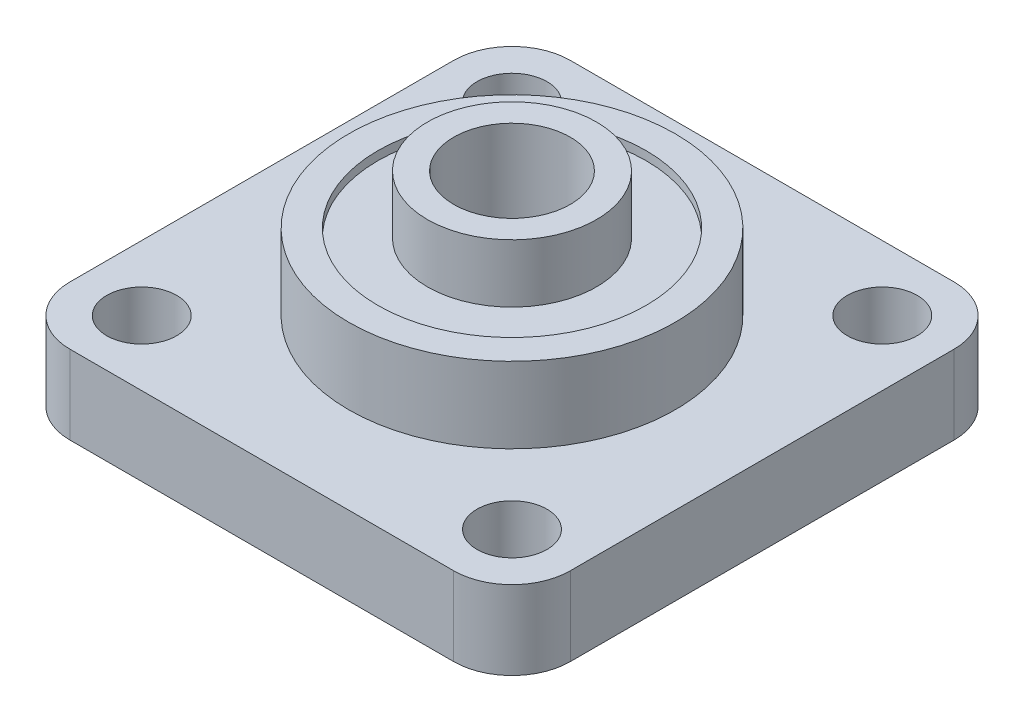
ISO-10303-21;
HEADER;
FILE_DESCRIPTION(('STEP AP214'),'2;1');
FILE_NAME('part.step','',(''),(''),'','','');
FILE_SCHEMA(('AUTOMOTIVE_DESIGN { 1 0 10303 214 1 1 1 1 }'));
ENDSEC;
DATA;
#1=APPLICATION_CONTEXT('core data for automotive mechanical design processes');
#2=APPLICATION_PROTOCOL_DEFINITION('international standard','automotive_design',2000,#1);
#3=PRODUCT_CONTEXT('',#1,'mechanical');
#4=PRODUCT('Part','Part','',(#3));
#5=PRODUCT_RELATED_PRODUCT_CATEGORY('part','',(#4));
#6=PRODUCT_DEFINITION_FORMATION('','',#4);
#7=PRODUCT_DEFINITION_CONTEXT('part definition',#1,'design');
#8=PRODUCT_DEFINITION('design','',#6,#7);
#9=PRODUCT_DEFINITION_SHAPE('','',#8);
#10=(LENGTH_UNIT() NAMED_UNIT(*) SI_UNIT(.MILLI.,.METRE.));
#11=(NAMED_UNIT(*) PLANE_ANGLE_UNIT() SI_UNIT($,.RADIAN.));
#12=(NAMED_UNIT(*) SI_UNIT($,.STERADIAN.) SOLID_ANGLE_UNIT());
#13=UNCERTAINTY_MEASURE_WITH_UNIT(LENGTH_MEASURE(1.E-05),#10,'distance_accuracy_value','');
#14=(GEOMETRIC_REPRESENTATION_CONTEXT(3) GLOBAL_UNCERTAINTY_ASSIGNED_CONTEXT((#13)) GLOBAL_UNIT_ASSIGNED_CONTEXT((#10,
#11,#12)) REPRESENTATION_CONTEXT('',''));
#15=CARTESIAN_POINT('',(0.,0.,0.));
#16=DIRECTION('',(0.,0.,1.));
#17=DIRECTION('',(1.,0.,0.));
#18=AXIS2_PLACEMENT_3D('',#15,#16,#17);
#19=CARTESIAN_POINT('',(0.,50.9424778761063,0.));
#20=DIRECTION('',(0.,1.,0.));
#21=DIRECTION('',(0.,0.,1.));
#22=AXIS2_PLACEMENT_3D('',#19,#20,#21);
#23=CYLINDRICAL_SURFACE('',#22,10.);
#24=CARTESIAN_POINT('',(0.,30.,0.));
#25=DIRECTION('',(0.,1.,0.));
#26=DIRECTION('',(0.,0.,1.));
#27=AXIS2_PLACEMENT_3D('',#24,#25,#26);
#28=CIRCLE('',#27,10.);
#29=CARTESIAN_POINT('',(0.,30.,10.));
#30=VERTEX_POINT('',#29);
#31=EDGE_CURVE('E161',#30,#30,#28,.T.);
#32=ORIENTED_EDGE('',*,*,#31,.T.);
#33=EDGE_LOOP('',(#32));
#34=FACE_BOUND('',#33,.T.);
#35=CARTESIAN_POINT('',(0.,-5.,0.));
#36=DIRECTION('',(0.,1.,0.));
#37=DIRECTION('',(0.,0.,1.));
#38=AXIS2_PLACEMENT_3D('',#35,#36,#37);
#39=CIRCLE('',#38,10.);
#40=CARTESIAN_POINT('',(0.,-5.,10.));
#41=VERTEX_POINT('',#40);
#42=EDGE_CURVE('E223',#41,#41,#39,.T.);
#43=ORIENTED_EDGE('',*,*,#42,.F.);
#44=EDGE_LOOP('',(#43));
#45=FACE_BOUND('',#44,.T.);
#46=ADVANCED_FACE('F37',(#34,#45),#23,.F.);
#47=CARTESIAN_POINT('',(10.,30.,0.));
#48=DIRECTION('',(0.,1.,0.));
#49=DIRECTION('',(0.,0.,1.));
#50=AXIS2_PLACEMENT_3D('',#47,#48,#49);
#51=PLANE('',#50);
#52=CARTESIAN_POINT('',(0.,30.,0.));
#53=DIRECTION('',(0.,1.,0.));
#54=DIRECTION('',(0.,0.,1.));
#55=AXIS2_PLACEMENT_3D('',#52,#53,#54);
#56=CIRCLE('',#55,14.5);
#57=CARTESIAN_POINT('',(0.,30.,14.5));
#58=VERTEX_POINT('',#57);
#59=EDGE_CURVE('E158',#58,#58,#56,.T.);
#60=ORIENTED_EDGE('',*,*,#59,.T.);
#61=EDGE_LOOP('',(#60));
#62=FACE_BOUND('',#61,.T.);
#63=ORIENTED_EDGE('',*,*,#31,.F.);
#64=EDGE_LOOP('',(#63));
#65=FACE_BOUND('',#64,.T.);
#66=ADVANCED_FACE('F231',(#62,#65),#51,.T.);
#67=CARTESIAN_POINT('',(0.,50.9424778761063,0.));
#68=DIRECTION('',(0.,1.,0.));
#69=DIRECTION('',(0.,0.,1.));
#70=AXIS2_PLACEMENT_3D('',#67,#68,#69);
#71=CYLINDRICAL_SURFACE('',#70,14.5);
#72=CARTESIAN_POINT('',(0.,20.,0.));
#73=DIRECTION('',(0.,1.,0.));
#74=DIRECTION('',(0.,0.,1.));
#75=AXIS2_PLACEMENT_3D('',#72,#73,#74);
#76=CIRCLE('',#75,14.5);
#77=CARTESIAN_POINT('',(0.,20.,14.5));
#78=VERTEX_POINT('',#77);
#79=EDGE_CURVE('E155',#78,#78,#76,.T.);
#80=ORIENTED_EDGE('',*,*,#79,.T.);
#81=EDGE_LOOP('',(#80));
#82=FACE_BOUND('',#81,.T.);
#83=ORIENTED_EDGE('',*,*,#59,.F.);
#84=EDGE_LOOP('',(#83));
#85=FACE_BOUND('',#84,.T.);
#86=ADVANCED_FACE('F237',(#82,#85),#71,.T.);
#87=CARTESIAN_POINT('',(14.5,20.,0.));
#88=DIRECTION('',(0.,1.,0.));
#89=DIRECTION('',(0.,0.,1.));
#90=AXIS2_PLACEMENT_3D('',#87,#88,#89);
#91=PLANE('',#90);
#92=CARTESIAN_POINT('',(0.,20.,0.));
#93=DIRECTION('',(0.,1.,0.));
#94=DIRECTION('',(0.,0.,1.));
#95=AXIS2_PLACEMENT_3D('',#92,#93,#94);
#96=CIRCLE('',#95,23.);
#97=CARTESIAN_POINT('',(0.,20.,23.));
#98=VERTEX_POINT('',#97);
#99=EDGE_CURVE('E152',#98,#98,#96,.T.);
#100=ORIENTED_EDGE('',*,*,#99,.T.);
#101=EDGE_LOOP('',(#100));
#102=FACE_BOUND('',#101,.T.);
#103=ORIENTED_EDGE('',*,*,#79,.F.);
#104=EDGE_LOOP('',(#103));
#105=FACE_BOUND('',#104,.T.);
#106=ADVANCED_FACE('F289',(#102,#105),#91,.T.);
#107=CARTESIAN_POINT('',(0.,50.9424778761063,0.));
#108=DIRECTION('',(0.,1.,0.));
#109=DIRECTION('',(0.,0.,1.));
#110=AXIS2_PLACEMENT_3D('',#107,#108,#109);
#111=CYLINDRICAL_SURFACE('',#110,23.);
#112=CARTESIAN_POINT('',(0.,21.5,0.));
#113=DIRECTION('',(0.,1.,0.));
#114=DIRECTION('',(0.,0.,1.));
#115=AXIS2_PLACEMENT_3D('',#112,#113,#114);
#116=CIRCLE('',#115,23.);
#117=CARTESIAN_POINT('',(0.,21.5,23.));
#118=VERTEX_POINT('',#117);
#119=EDGE_CURVE('E149',#118,#118,#116,.T.);
#120=ORIENTED_EDGE('',*,*,#119,.T.);
#121=EDGE_LOOP('',(#120));
#122=FACE_BOUND('',#121,.T.);
#123=ORIENTED_EDGE('',*,*,#99,.F.);
#124=EDGE_LOOP('',(#123));
#125=FACE_BOUND('',#124,.T.);
#126=ADVANCED_FACE('F285',(#122,#125),#111,.F.);
#127=CARTESIAN_POINT('',(23.,21.5,0.));
#128=DIRECTION('',(0.,1.,0.));
#129=DIRECTION('',(0.,0.,1.));
#130=AXIS2_PLACEMENT_3D('',#127,#128,#129);
#131=PLANE('',#130);
#132=CARTESIAN_POINT('',(0.,21.5,0.));
#133=DIRECTION('',(0.,1.,0.));
#134=DIRECTION('',(0.,0.,1.));
#135=AXIS2_PLACEMENT_3D('',#132,#133,#134);
#136=CIRCLE('',#135,28.);
#137=CARTESIAN_POINT('',(0.,21.5,28.));
#138=VERTEX_POINT('',#137);
#139=EDGE_CURVE('E146',#138,#138,#136,.T.);
#140=ORIENTED_EDGE('',*,*,#139,.T.);
#141=EDGE_LOOP('',(#140));
#142=FACE_BOUND('',#141,.T.);
#143=ORIENTED_EDGE('',*,*,#119,.F.);
#144=EDGE_LOOP('',(#143));
#145=FACE_BOUND('',#144,.T.);
#146=ADVANCED_FACE('F281',(#142,#145),#131,.T.);
#147=CARTESIAN_POINT('',(0.,50.9424778761063,0.));
#148=DIRECTION('',(0.,1.,0.));
#149=DIRECTION('',(0.,0.,1.));
#150=AXIS2_PLACEMENT_3D('',#147,#148,#149);
#151=CYLINDRICAL_SURFACE('',#150,28.);
#152=CARTESIAN_POINT('',(0.,8.49999999999999,0.));
#153=DIRECTION('',(0.,1.,0.));
#154=DIRECTION('',(0.,0.,1.));
#155=AXIS2_PLACEMENT_3D('',#152,#153,#154);
#156=CIRCLE('',#155,28.);
#157=CARTESIAN_POINT('',(0.,8.49999999999999,28.));
#158=VERTEX_POINT('',#157);
#159=EDGE_CURVE('E164',#158,#158,#156,.F.);
#160=ORIENTED_EDGE('',*,*,#159,.F.);
#161=EDGE_LOOP('',(#160));
#162=FACE_BOUND('',#161,.T.);
#163=ORIENTED_EDGE('',*,*,#139,.F.);
#164=EDGE_LOOP('',(#163));
#165=FACE_BOUND('',#164,.T.);
#166=ADVANCED_FACE('F277',(#162,#165),#151,.T.);
#167=CARTESIAN_POINT('',(-31.75,8.49999999999999,31.75));
#168=DIRECTION('',(0.,-1.,0.));
#169=DIRECTION('',(0.,0.,-1.));
#170=AXIS2_PLACEMENT_3D('',#167,#168,#169);
#171=CYLINDRICAL_SURFACE('',#170,6.);
#172=CARTESIAN_POINT('',(-31.75,8.49999999999999,31.75));
#173=DIRECTION('',(0.,1.,0.));
#174=DIRECTION('',(0.,0.,1.));
#175=AXIS2_PLACEMENT_3D('',#172,#173,#174);
#176=CIRCLE('',#175,6.);
#177=CARTESIAN_POINT('',(-31.75,8.49999999999999,37.75));
#178=VERTEX_POINT('',#177);
#179=EDGE_CURVE('E217',#178,#178,#176,.T.);
#180=ORIENTED_EDGE('',*,*,#179,.T.);
#181=EDGE_LOOP('',(#180));
#182=FACE_BOUND('',#181,.T.);
#183=CARTESIAN_POINT('',(-31.75,-5.,31.75));
#184=DIRECTION('',(0.,1.,0.));
#185=DIRECTION('',(0.,0.,1.));
#186=AXIS2_PLACEMENT_3D('',#183,#184,#185);
#187=CIRCLE('',#186,6.);
#188=CARTESIAN_POINT('',(-31.75,-5.,37.75));
#189=VERTEX_POINT('',#188);
#190=EDGE_CURVE('E220',#189,#189,#187,.T.);
#191=ORIENTED_EDGE('',*,*,#190,.F.);
#192=EDGE_LOOP('',(#191));
#193=FACE_BOUND('',#192,.T.);
#194=ADVANCED_FACE('F280',(#182,#193),#171,.F.);
#195=CARTESIAN_POINT('',(31.75,8.49999999999999,31.75));
#196=DIRECTION('',(0.,-1.,0.));
#197=DIRECTION('',(0.,0.,-1.));
#198=AXIS2_PLACEMENT_3D('',#195,#196,#197);
#199=CYLINDRICAL_SURFACE('',#198,5.99999999999999);
#200=CARTESIAN_POINT('',(31.75,8.49999999999999,31.75));
#201=DIRECTION('',(0.,1.,0.));
#202=DIRECTION('',(0.,0.,1.));
#203=AXIS2_PLACEMENT_3D('',#200,#201,#202);
#204=CIRCLE('',#203,5.99999999999999);
#205=CARTESIAN_POINT('',(31.75,8.49999999999999,37.75));
#206=VERTEX_POINT('',#205);
#207=EDGE_CURVE('E211',#206,#206,#204,.T.);
#208=ORIENTED_EDGE('',*,*,#207,.T.);
#209=EDGE_LOOP('',(#208));
#210=FACE_BOUND('',#209,.T.);
#211=CARTESIAN_POINT('',(31.75,-5.,31.75));
#212=DIRECTION('',(0.,1.,0.));
#213=DIRECTION('',(0.,0.,1.));
#214=AXIS2_PLACEMENT_3D('',#211,#212,#213);
#215=CIRCLE('',#214,5.99999999999999);
#216=CARTESIAN_POINT('',(31.75,-5.,37.75));
#217=VERTEX_POINT('',#216);
#218=EDGE_CURVE('E214',#217,#217,#215,.T.);
#219=ORIENTED_EDGE('',*,*,#218,.F.);
#220=EDGE_LOOP('',(#219));
#221=FACE_BOUND('',#220,.T.);
#222=ADVANCED_FACE('F327',(#210,#221),#199,.F.);
#223=CARTESIAN_POINT('',(31.75,8.49999999999999,-31.75));
#224=DIRECTION('',(0.,-1.,0.));
#225=DIRECTION('',(0.,0.,-1.));
#226=AXIS2_PLACEMENT_3D('',#223,#224,#225);
#227=CYLINDRICAL_SURFACE('',#226,6.);
#228=CARTESIAN_POINT('',(31.75,8.49999999999999,-31.75));
#229=DIRECTION('',(0.,1.,0.));
#230=DIRECTION('',(0.,0.,1.));
#231=AXIS2_PLACEMENT_3D('',#228,#229,#230);
#232=CIRCLE('',#231,6.);
#233=CARTESIAN_POINT('',(31.75,8.49999999999999,-25.75));
#234=VERTEX_POINT('',#233);
#235=EDGE_CURVE('E206',#234,#234,#232,.T.);
#236=ORIENTED_EDGE('',*,*,#235,.T.);
#237=EDGE_LOOP('',(#236));
#238=FACE_BOUND('',#237,.T.);
#239=CARTESIAN_POINT('',(31.75,-5.,-31.75));
#240=DIRECTION('',(0.,1.,0.));
#241=DIRECTION('',(0.,0.,1.));
#242=AXIS2_PLACEMENT_3D('',#239,#240,#241);
#243=CIRCLE('',#242,6.);
#244=CARTESIAN_POINT('',(31.75,-5.,-25.75));
#245=VERTEX_POINT('',#244);
#246=EDGE_CURVE('E208',#245,#245,#243,.T.);
#247=ORIENTED_EDGE('',*,*,#246,.F.);
#248=EDGE_LOOP('',(#247));
#249=FACE_BOUND('',#248,.T.);
#250=ADVANCED_FACE('F267',(#238,#249),#227,.F.);
#251=CARTESIAN_POINT('',(-31.75,8.49999999999999,-31.75));
#252=DIRECTION('',(0.,-1.,0.));
#253=DIRECTION('',(0.,0.,-1.));
#254=AXIS2_PLACEMENT_3D('',#251,#252,#253);
#255=CYLINDRICAL_SURFACE('',#254,6.);
#256=CARTESIAN_POINT('',(-31.75,8.49999999999999,-31.75));
#257=DIRECTION('',(0.,1.,0.));
#258=DIRECTION('',(0.,0.,1.));
#259=AXIS2_PLACEMENT_3D('',#256,#257,#258);
#260=CIRCLE('',#259,6.);
#261=CARTESIAN_POINT('',(-31.75,8.49999999999999,-25.75));
#262=VERTEX_POINT('',#261);
#263=EDGE_CURVE('E131',#262,#262,#260,.T.);
#264=ORIENTED_EDGE('',*,*,#263,.T.);
#265=EDGE_LOOP('',(#264));
#266=FACE_BOUND('',#265,.T.);
#267=CARTESIAN_POINT('',(-31.75,-5.,-31.75));
#268=DIRECTION('',(0.,1.,0.));
#269=DIRECTION('',(0.,0.,1.));
#270=AXIS2_PLACEMENT_3D('',#267,#268,#269);
#271=CIRCLE('',#270,6.);
#272=CARTESIAN_POINT('',(-31.75,-5.,-25.75));
#273=VERTEX_POINT('',#272);
#274=EDGE_CURVE('E137',#273,#273,#271,.T.);
#275=ORIENTED_EDGE('',*,*,#274,.F.);
#276=EDGE_LOOP('',(#275));
#277=FACE_BOUND('',#276,.T.);
#278=ADVANCED_FACE('F260',(#266,#277),#255,.F.);
#279=CARTESIAN_POINT('',(-42.9,8.49999999999999,42.9));
#280=DIRECTION('',(0.,0.,-1.));
#281=DIRECTION('',(-1.,0.,0.));
#282=AXIS2_PLACEMENT_3D('',#279,#280,#281);
#283=PLANE('',#282);
#284=DIRECTION('',(1.,0.,0.));
#285=VECTOR('',#284,1.);
#286=CARTESIAN_POINT('',(-42.9,-5.,42.9));
#287=LINE('',#286,#285);
#288=CARTESIAN_POINT('',(-32.9,-5.,42.9));
#289=VERTEX_POINT('',#288);
#290=CARTESIAN_POINT('',(32.9,-5.,42.9));
#291=VERTEX_POINT('',#290);
#292=EDGE_CURVE('E144',#289,#291,#287,.T.);
#293=ORIENTED_EDGE('',*,*,#292,.T.);
#294=DIRECTION('',(0.,-1.,0.));
#295=VECTOR('',#294,1.);
#296=CARTESIAN_POINT('',(32.9,8.49999999999999,42.9));
#297=LINE('',#296,#295);
#298=CARTESIAN_POINT('',(32.9,8.49999999999999,42.9));
#299=VERTEX_POINT('',#298);
#300=EDGE_CURVE('E108',#291,#299,#297,.F.);
#301=ORIENTED_EDGE('',*,*,#300,.T.);
#302=DIRECTION('',(1.,0.,0.));
#303=VECTOR('',#302,1.);
#304=CARTESIAN_POINT('',(-42.9,8.49999999999999,42.9));
#305=LINE('',#304,#303);
#306=CARTESIAN_POINT('',(-32.9,8.49999999999999,42.9));
#307=VERTEX_POINT('',#306);
#308=EDGE_CURVE('E140',#307,#299,#305,.T.);
#309=ORIENTED_EDGE('',*,*,#308,.F.);
#310=DIRECTION('',(0.,-1.,0.));
#311=VECTOR('',#310,1.);
#312=CARTESIAN_POINT('',(-32.9,8.49999999999999,42.9));
#313=LINE('',#312,#311);
#314=EDGE_CURVE('E113',#307,#289,#313,.T.);
#315=ORIENTED_EDGE('',*,*,#314,.T.);
#316=EDGE_LOOP('',(#293,#301,#309,#315));
#317=FACE_BOUND('',#316,.T.);
#318=ADVANCED_FACE('F258',(#317),#283,.F.);
#319=CARTESIAN_POINT('',(-42.9,8.49999999999999,-42.9));
#320=DIRECTION('',(1.,0.,0.));
#321=DIRECTION('',(0.,0.,-1.));
#322=AXIS2_PLACEMENT_3D('',#319,#320,#321);
#323=PLANE('',#322);
#324=DIRECTION('',(0.,0.,1.));
#325=VECTOR('',#324,1.);
#326=CARTESIAN_POINT('',(-42.9,8.49999999999999,-42.9));
#327=LINE('',#326,#325);
#328=CARTESIAN_POINT('',(-42.9,8.49999999999999,-32.9));
#329=VERTEX_POINT('',#328);
#330=CARTESIAN_POINT('',(-42.9,8.49999999999999,32.9));
#331=VERTEX_POINT('',#330);
#332=EDGE_CURVE('E199',#329,#331,#327,.T.);
#333=ORIENTED_EDGE('',*,*,#332,.F.);
#334=DIRECTION('',(0.,-1.,0.));
#335=VECTOR('',#334,1.);
#336=CARTESIAN_POINT('',(-42.9,8.49999999999999,-32.9));
#337=LINE('',#336,#335);
#338=CARTESIAN_POINT('',(-42.9,-5.,-32.9));
#339=VERTEX_POINT('',#338);
#340=EDGE_CURVE('E11',#329,#339,#337,.T.);
#341=ORIENTED_EDGE('',*,*,#340,.T.);
#342=DIRECTION('',(0.,0.,1.));
#343=VECTOR('',#342,1.);
#344=CARTESIAN_POINT('',(-42.9,-5.,-42.9));
#345=LINE('',#344,#343);
#346=CARTESIAN_POINT('',(-42.9,-5.,32.9));
#347=VERTEX_POINT('',#346);
#348=EDGE_CURVE('E134',#339,#347,#345,.T.);
#349=ORIENTED_EDGE('',*,*,#348,.T.);
#350=DIRECTION('',(0.,-1.,0.));
#351=VECTOR('',#350,1.);
#352=CARTESIAN_POINT('',(-42.9,8.49999999999999,32.9));
#353=LINE('',#352,#351);
#354=EDGE_CURVE('E45',#347,#331,#353,.F.);
#355=ORIENTED_EDGE('',*,*,#354,.T.);
#356=EDGE_LOOP('',(#333,#341,#349,#355));
#357=FACE_BOUND('',#356,.T.);
#358=ADVANCED_FACE('F198',(#357),#323,.F.);
#359=CARTESIAN_POINT('',(-42.9,8.49999999999999,-42.9));
#360=DIRECTION('',(0.,0.,1.));
#361=DIRECTION('',(1.,0.,0.));
#362=AXIS2_PLACEMENT_3D('',#359,#360,#361);
#363=PLANE('',#362);
#364=DIRECTION('',(-1.,0.,0.));
#365=VECTOR('',#364,1.);
#366=CARTESIAN_POINT('',(-42.9,8.49999999999999,-42.9));
#367=LINE('',#366,#365);
#368=CARTESIAN_POINT('',(32.9,8.49999999999999,-42.9));
#369=VERTEX_POINT('',#368);
#370=CARTESIAN_POINT('',(-32.9,8.49999999999999,-42.9));
#371=VERTEX_POINT('',#370);
#372=EDGE_CURVE('E191',#369,#371,#367,.T.);
#373=ORIENTED_EDGE('',*,*,#372,.F.);
#374=DIRECTION('',(0.,-1.,0.));
#375=VECTOR('',#374,1.);
#376=CARTESIAN_POINT('',(32.9,8.49999999999999,-42.9));
#377=LINE('',#376,#375);
#378=CARTESIAN_POINT('',(32.9,-5.,-42.9));
#379=VERTEX_POINT('',#378);
#380=EDGE_CURVE('E184',#369,#379,#377,.T.);
#381=ORIENTED_EDGE('',*,*,#380,.T.);
#382=DIRECTION('',(-1.,0.,0.));
#383=VECTOR('',#382,1.);
#384=CARTESIAN_POINT('',(-42.9,-5.,-42.9));
#385=LINE('',#384,#383);
#386=CARTESIAN_POINT('',(-32.9,-5.,-42.9));
#387=VERTEX_POINT('',#386);
#388=EDGE_CURVE('E130',#379,#387,#385,.T.);
#389=ORIENTED_EDGE('',*,*,#388,.T.);
#390=DIRECTION('',(0.,-1.,0.));
#391=VECTOR('',#390,1.);
#392=CARTESIAN_POINT('',(-32.9,8.49999999999999,-42.9));
#393=LINE('',#392,#391);
#394=EDGE_CURVE('E182',#387,#371,#393,.F.);
#395=ORIENTED_EDGE('',*,*,#394,.T.);
#396=EDGE_LOOP('',(#373,#381,#389,#395));
#397=FACE_BOUND('',#396,.T.);
#398=ADVANCED_FACE('F189',(#397),#363,.F.);
#399=CARTESIAN_POINT('',(42.9,8.49999999999999,-42.9));
#400=DIRECTION('',(-1.,0.,0.));
#401=DIRECTION('',(0.,0.,1.));
#402=AXIS2_PLACEMENT_3D('',#399,#400,#401);
#403=PLANE('',#402);
#404=DIRECTION('',(0.,0.,-1.));
#405=VECTOR('',#404,1.);
#406=CARTESIAN_POINT('',(42.9,8.49999999999999,-42.9));
#407=LINE('',#406,#405);
#408=CARTESIAN_POINT('',(42.9,8.49999999999999,32.9));
#409=VERTEX_POINT('',#408);
#410=CARTESIAN_POINT('',(42.9,8.49999999999999,-32.9));
#411=VERTEX_POINT('',#410);
#412=EDGE_CURVE('E123',#409,#411,#407,.T.);
#413=ORIENTED_EDGE('',*,*,#412,.F.);
#414=DIRECTION('',(0.,-1.,0.));
#415=VECTOR('',#414,1.);
#416=CARTESIAN_POINT('',(42.9,8.49999999999999,32.9));
#417=LINE('',#416,#415);
#418=CARTESIAN_POINT('',(42.9,-5.,32.9));
#419=VERTEX_POINT('',#418);
#420=EDGE_CURVE('E107',#409,#419,#417,.T.);
#421=ORIENTED_EDGE('',*,*,#420,.T.);
#422=DIRECTION('',(0.,0.,-1.));
#423=VECTOR('',#422,1.);
#424=CARTESIAN_POINT('',(42.9,-5.,-42.9));
#425=LINE('',#424,#423);
#426=CARTESIAN_POINT('',(42.9,-5.,-32.9));
#427=VERTEX_POINT('',#426);
#428=EDGE_CURVE('E120',#419,#427,#425,.T.);
#429=ORIENTED_EDGE('',*,*,#428,.T.);
#430=DIRECTION('',(0.,-1.,0.));
#431=VECTOR('',#430,1.);
#432=CARTESIAN_POINT('',(42.9,8.49999999999999,-32.9));
#433=LINE('',#432,#431);
#434=EDGE_CURVE('E125',#427,#411,#433,.F.);
#435=ORIENTED_EDGE('',*,*,#434,.T.);
#436=EDGE_LOOP('',(#413,#421,#429,#435));
#437=FACE_BOUND('',#436,.T.);
#438=ADVANCED_FACE('F119',(#437),#403,.F.);
#439=CARTESIAN_POINT('',(0.,-5.,0.));
#440=DIRECTION('',(0.,1.,0.));
#441=DIRECTION('',(0.,0.,1.));
#442=AXIS2_PLACEMENT_3D('',#439,#440,#441);
#443=PLANE('',#442);
#444=ORIENTED_EDGE('',*,*,#42,.T.);
#445=EDGE_LOOP('',(#444));
#446=FACE_BOUND('',#445,.T.);
#447=ORIENTED_EDGE('',*,*,#428,.F.);
#448=CARTESIAN_POINT('',(32.9,-5.,32.9));
#449=DIRECTION('',(0.,1.,0.));
#450=DIRECTION('',(0.,0.,1.));
#451=AXIS2_PLACEMENT_3D('',#448,#449,#450);
#452=CIRCLE('',#451,10.);
#453=EDGE_CURVE('E103',#419,#291,#452,.F.);
#454=ORIENTED_EDGE('',*,*,#453,.T.);
#455=ORIENTED_EDGE('',*,*,#292,.F.);
#456=CARTESIAN_POINT('',(-32.9,-5.,32.9));
#457=DIRECTION('',(0.,1.,0.));
#458=DIRECTION('',(0.,0.,1.));
#459=AXIS2_PLACEMENT_3D('',#456,#457,#458);
#460=CIRCLE('',#459,10.);
#461=EDGE_CURVE('E124',#289,#347,#460,.F.);
#462=ORIENTED_EDGE('',*,*,#461,.T.);
#463=ORIENTED_EDGE('',*,*,#348,.F.);
#464=CARTESIAN_POINT('',(-32.9,-5.,-32.9));
#465=DIRECTION('',(0.,1.,0.));
#466=DIRECTION('',(0.,0.,1.));
#467=AXIS2_PLACEMENT_3D('',#464,#465,#466);
#468=CIRCLE('',#467,10.);
#469=EDGE_CURVE('E169',#339,#387,#468,.F.);
#470=ORIENTED_EDGE('',*,*,#469,.T.);
#471=ORIENTED_EDGE('',*,*,#388,.F.);
#472=CARTESIAN_POINT('',(32.9,-5.,-32.9));
#473=DIRECTION('',(0.,1.,0.));
#474=DIRECTION('',(0.,0.,1.));
#475=AXIS2_PLACEMENT_3D('',#472,#473,#474);
#476=CIRCLE('',#475,10.);
#477=EDGE_CURVE('E114',#379,#427,#476,.F.);
#478=ORIENTED_EDGE('',*,*,#477,.T.);
#479=EDGE_LOOP('',(#447,#454,#455,#462,#463,#470,#471,#478));
#480=FACE_BOUND('',#479,.T.);
#481=ORIENTED_EDGE('',*,*,#274,.T.);
#482=EDGE_LOOP('',(#481));
#483=FACE_BOUND('',#482,.T.);
#484=ORIENTED_EDGE('',*,*,#246,.T.);
#485=EDGE_LOOP('',(#484));
#486=FACE_BOUND('',#485,.T.);
#487=ORIENTED_EDGE('',*,*,#218,.T.);
#488=EDGE_LOOP('',(#487));
#489=FACE_BOUND('',#488,.T.);
#490=ORIENTED_EDGE('',*,*,#190,.T.);
#491=EDGE_LOOP('',(#490));
#492=FACE_BOUND('',#491,.T.);
#493=ADVANCED_FACE('F127',(#446,#480,#483,#486,#489,#492),#443,.F.);
#494=CARTESIAN_POINT('',(0.,8.49999999999999,0.));
#495=DIRECTION('',(0.,1.,0.));
#496=DIRECTION('',(0.,0.,1.));
#497=AXIS2_PLACEMENT_3D('',#494,#495,#496);
#498=PLANE('',#497);
#499=ORIENTED_EDGE('',*,*,#159,.T.);
#500=EDGE_LOOP('',(#499));
#501=FACE_BOUND('',#500,.T.);
#502=ORIENTED_EDGE('',*,*,#207,.F.);
#503=EDGE_LOOP('',(#502));
#504=FACE_BOUND('',#503,.T.);
#505=ORIENTED_EDGE('',*,*,#263,.F.);
#506=EDGE_LOOP('',(#505));
#507=FACE_BOUND('',#506,.T.);
#508=ORIENTED_EDGE('',*,*,#308,.T.);
#509=CARTESIAN_POINT('',(32.9,8.49999999999999,32.9));
#510=DIRECTION('',(0.,1.,0.));
#511=DIRECTION('',(0.,0.,1.));
#512=AXIS2_PLACEMENT_3D('',#509,#510,#511);
#513=CIRCLE('',#512,10.);
#514=EDGE_CURVE('E180',#299,#409,#513,.T.);
#515=ORIENTED_EDGE('',*,*,#514,.T.);
#516=ORIENTED_EDGE('',*,*,#412,.T.);
#517=CARTESIAN_POINT('',(32.9,8.49999999999999,-32.9));
#518=DIRECTION('',(0.,1.,0.));
#519=DIRECTION('',(0.,0.,1.));
#520=AXIS2_PLACEMENT_3D('',#517,#518,#519);
#521=CIRCLE('',#520,10.);
#522=EDGE_CURVE('E178',#411,#369,#521,.T.);
#523=ORIENTED_EDGE('',*,*,#522,.T.);
#524=ORIENTED_EDGE('',*,*,#372,.T.);
#525=CARTESIAN_POINT('',(-32.9,8.49999999999999,-32.9));
#526=DIRECTION('',(0.,1.,0.));
#527=DIRECTION('',(0.,0.,1.));
#528=AXIS2_PLACEMENT_3D('',#525,#526,#527);
#529=CIRCLE('',#528,10.);
#530=EDGE_CURVE('E58',#371,#329,#529,.T.);
#531=ORIENTED_EDGE('',*,*,#530,.T.);
#532=ORIENTED_EDGE('',*,*,#332,.T.);
#533=CARTESIAN_POINT('',(-32.9,8.49999999999999,32.9));
#534=DIRECTION('',(0.,1.,0.));
#535=DIRECTION('',(0.,0.,1.));
#536=AXIS2_PLACEMENT_3D('',#533,#534,#535);
#537=CIRCLE('',#536,10.);
#538=EDGE_CURVE('E175',#331,#307,#537,.T.);
#539=ORIENTED_EDGE('',*,*,#538,.T.);
#540=EDGE_LOOP('',(#508,#515,#516,#523,#524,#531,#532,#539));
#541=FACE_BOUND('',#540,.T.);
#542=ORIENTED_EDGE('',*,*,#235,.F.);
#543=EDGE_LOOP('',(#542));
#544=FACE_BOUND('',#543,.T.);
#545=ORIENTED_EDGE('',*,*,#179,.F.);
#546=EDGE_LOOP('',(#545));
#547=FACE_BOUND('',#546,.T.);
#548=ADVANCED_FACE('F245',(#501,#504,#507,#541,#544,#547),#498,.T.);
#549=CARTESIAN_POINT('',(32.9,8.49999999999999,32.9));
#550=DIRECTION('',(0.,-1.,0.));
#551=DIRECTION('',(0.,0.,-1.));
#552=AXIS2_PLACEMENT_3D('',#549,#550,#551);
#553=CYLINDRICAL_SURFACE('',#552,10.);
#554=ORIENTED_EDGE('',*,*,#514,.F.);
#555=ORIENTED_EDGE('',*,*,#300,.F.);
#556=ORIENTED_EDGE('',*,*,#453,.F.);
#557=ORIENTED_EDGE('',*,*,#420,.F.);
#558=EDGE_LOOP('',(#554,#555,#556,#557));
#559=FACE_BOUND('',#558,.T.);
#560=ADVANCED_FACE('F106',(#559),#553,.T.);
#561=CARTESIAN_POINT('',(32.9,8.49999999999999,-32.9));
#562=DIRECTION('',(0.,-1.,0.));
#563=DIRECTION('',(0.,0.,-1.));
#564=AXIS2_PLACEMENT_3D('',#561,#562,#563);
#565=CYLINDRICAL_SURFACE('',#564,10.);
#566=ORIENTED_EDGE('',*,*,#522,.F.);
#567=ORIENTED_EDGE('',*,*,#434,.F.);
#568=ORIENTED_EDGE('',*,*,#477,.F.);
#569=ORIENTED_EDGE('',*,*,#380,.F.);
#570=EDGE_LOOP('',(#566,#567,#568,#569));
#571=FACE_BOUND('',#570,.T.);
#572=ADVANCED_FACE('F244',(#571),#565,.T.);
#573=CARTESIAN_POINT('',(-32.9,8.49999999999999,-32.9));
#574=DIRECTION('',(0.,-1.,0.));
#575=DIRECTION('',(0.,0.,-1.));
#576=AXIS2_PLACEMENT_3D('',#573,#574,#575);
#577=CYLINDRICAL_SURFACE('',#576,10.);
#578=ORIENTED_EDGE('',*,*,#530,.F.);
#579=ORIENTED_EDGE('',*,*,#394,.F.);
#580=ORIENTED_EDGE('',*,*,#469,.F.);
#581=ORIENTED_EDGE('',*,*,#340,.F.);
#582=EDGE_LOOP('',(#578,#579,#580,#581));
#583=FACE_BOUND('',#582,.T.);
#584=ADVANCED_FACE('F197',(#583),#577,.T.);
#585=CARTESIAN_POINT('',(-32.9,8.49999999999999,32.9));
#586=DIRECTION('',(0.,-1.,0.));
#587=DIRECTION('',(0.,0.,-1.));
#588=AXIS2_PLACEMENT_3D('',#585,#586,#587);
#589=CYLINDRICAL_SURFACE('',#588,10.);
#590=ORIENTED_EDGE('',*,*,#538,.F.);
#591=ORIENTED_EDGE('',*,*,#354,.F.);
#592=ORIENTED_EDGE('',*,*,#461,.F.);
#593=ORIENTED_EDGE('',*,*,#314,.F.);
#594=EDGE_LOOP('',(#590,#591,#592,#593));
#595=FACE_BOUND('',#594,.T.);
#596=ADVANCED_FACE('F39',(#595),#589,.T.);
#597=CLOSED_SHELL('',(#46,#66,#86,#106,#126,#146,#166,#194,#222,#250,#278,#318,#358,#398,#438,
#493,#548,#560,#572,#584,#596));
#598=MANIFOLD_SOLID_BREP('B2',#597);
#599=ADVANCED_BREP_SHAPE_REPRESENTATION('',(#18,#598),#14);
#600=SHAPE_DEFINITION_REPRESENTATION(#9,#599);
ENDSEC;
END-ISO-10303-21;
